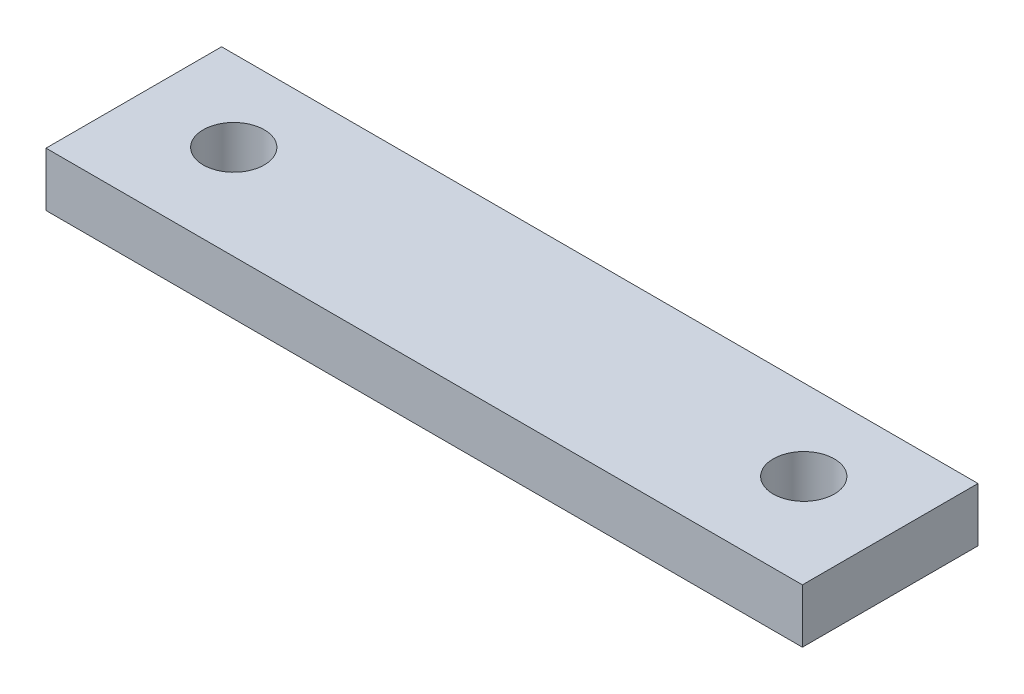
ISO-10303-21;
HEADER;
FILE_DESCRIPTION(('STEP AP214'),'2;1');
FILE_NAME('part.step','',(''),(''),'','','');
FILE_SCHEMA(('AUTOMOTIVE_DESIGN { 1 0 10303 214 1 1 1 1 }'));
ENDSEC;
DATA;
#1=APPLICATION_CONTEXT('core data for automotive mechanical design processes');
#2=APPLICATION_PROTOCOL_DEFINITION('international standard','automotive_design',2000,#1);
#3=PRODUCT_CONTEXT('',#1,'mechanical');
#4=PRODUCT('Part','Part','',(#3));
#5=PRODUCT_RELATED_PRODUCT_CATEGORY('part','',(#4));
#6=PRODUCT_DEFINITION_FORMATION('','',#4);
#7=PRODUCT_DEFINITION_CONTEXT('part definition',#1,'design');
#8=PRODUCT_DEFINITION('design','',#6,#7);
#9=PRODUCT_DEFINITION_SHAPE('','',#8);
#10=(LENGTH_UNIT() NAMED_UNIT(*) SI_UNIT(.MILLI.,.METRE.));
#11=(NAMED_UNIT(*) PLANE_ANGLE_UNIT() SI_UNIT($,.RADIAN.));
#12=(NAMED_UNIT(*) SI_UNIT($,.STERADIAN.) SOLID_ANGLE_UNIT());
#13=UNCERTAINTY_MEASURE_WITH_UNIT(LENGTH_MEASURE(1.E-05),#10,'distance_accuracy_value','');
#14=(GEOMETRIC_REPRESENTATION_CONTEXT(3) GLOBAL_UNCERTAINTY_ASSIGNED_CONTEXT((#13)) GLOBAL_UNIT_ASSIGNED_CONTEXT((#10,
#11,#12)) REPRESENTATION_CONTEXT('',''));
#15=CARTESIAN_POINT('',(0.,0.,0.));
#16=DIRECTION('',(0.,0.,1.));
#17=DIRECTION('',(1.,0.,0.));
#18=AXIS2_PLACEMENT_3D('',#15,#16,#17);
#19=CARTESIAN_POINT('',(0.,2.54,0.));
#20=DIRECTION('',(0.,1.,0.));
#21=DIRECTION('',(0.,0.,1.));
#22=AXIS2_PLACEMENT_3D('',#19,#20,#21);
#23=PLANE('',#22);
#24=CARTESIAN_POINT('',(-13.3985,2.54,0.));
#25=DIRECTION('',(0.,1.,0.));
#26=DIRECTION('',(0.,0.,1.));
#27=AXIS2_PLACEMENT_3D('',#24,#25,#26);
#28=CIRCLE('',#27,1.4351);
#29=CARTESIAN_POINT('',(-13.3985,2.54,1.4351));
#30=VERTEX_POINT('',#29);
#31=EDGE_CURVE('E104',#30,#30,#28,.T.);
#32=ORIENTED_EDGE('',*,*,#31,.F.);
#33=EDGE_LOOP('',(#32));
#34=FACE_BOUND('',#33,.T.);
#35=DIRECTION('',(0.,0.,-1.));
#36=VECTOR('',#35,1.);
#37=CARTESIAN_POINT('',(17.78,2.54,4.445));
#38=LINE('',#37,#36);
#39=CARTESIAN_POINT('',(17.78,2.54,4.445));
#40=VERTEX_POINT('',#39);
#41=CARTESIAN_POINT('',(17.78,2.54,-3.81));
#42=VERTEX_POINT('',#41);
#43=EDGE_CURVE('E89',#40,#42,#38,.T.);
#44=ORIENTED_EDGE('',*,*,#43,.T.);
#45=DIRECTION('',(-1.,0.,0.));
#46=VECTOR('',#45,1.);
#47=CARTESIAN_POINT('',(17.78,2.54,-3.81));
#48=LINE('',#47,#46);
#49=CARTESIAN_POINT('',(-17.78,2.54,-3.81));
#50=VERTEX_POINT('',#49);
#51=EDGE_CURVE('E84',#42,#50,#48,.T.);
#52=ORIENTED_EDGE('',*,*,#51,.T.);
#53=DIRECTION('',(0.,0.,1.));
#54=VECTOR('',#53,1.);
#55=CARTESIAN_POINT('',(-17.78,2.54,-3.81));
#56=LINE('',#55,#54);
#57=CARTESIAN_POINT('',(-17.78,2.54,4.445));
#58=VERTEX_POINT('',#57);
#59=EDGE_CURVE('E87',#50,#58,#56,.T.);
#60=ORIENTED_EDGE('',*,*,#59,.T.);
#61=DIRECTION('',(1.,0.,0.));
#62=VECTOR('',#61,1.);
#63=CARTESIAN_POINT('',(-17.78,2.54,4.445));
#64=LINE('',#63,#62);
#65=EDGE_CURVE('E54',#58,#40,#64,.T.);
#66=ORIENTED_EDGE('',*,*,#65,.T.);
#67=EDGE_LOOP('',(#44,#52,#60,#66));
#68=FACE_BOUND('',#67,.T.);
#69=CARTESIAN_POINT('',(13.3985,2.54,0.));
#70=DIRECTION('',(0.,1.,0.));
#71=DIRECTION('',(0.,0.,1.));
#72=AXIS2_PLACEMENT_3D('',#69,#70,#71);
#73=CIRCLE('',#72,1.4351);
#74=CARTESIAN_POINT('',(13.3985,2.54,1.4351));
#75=VERTEX_POINT('',#74);
#76=EDGE_CURVE('E119',#75,#75,#73,.T.);
#77=ORIENTED_EDGE('',*,*,#76,.F.);
#78=EDGE_LOOP('',(#77));
#79=FACE_BOUND('',#78,.T.);
#80=ADVANCED_FACE('F37',(#34,#68,#79),#23,.T.);
#81=CARTESIAN_POINT('',(0.,0.,0.));
#82=DIRECTION('',(0.,1.,0.));
#83=DIRECTION('',(0.,0.,1.));
#84=AXIS2_PLACEMENT_3D('',#81,#82,#83);
#85=PLANE('',#84);
#86=DIRECTION('',(0.,0.,-1.));
#87=VECTOR('',#86,1.);
#88=CARTESIAN_POINT('',(17.78,0.,4.445));
#89=LINE('',#88,#87);
#90=CARTESIAN_POINT('',(17.78,0.,4.445));
#91=VERTEX_POINT('',#90);
#92=CARTESIAN_POINT('',(17.78,0.,-3.81));
#93=VERTEX_POINT('',#92);
#94=EDGE_CURVE('E101',#91,#93,#89,.T.);
#95=ORIENTED_EDGE('',*,*,#94,.F.);
#96=DIRECTION('',(1.,0.,0.));
#97=VECTOR('',#96,1.);
#98=CARTESIAN_POINT('',(-17.78,0.,4.445));
#99=LINE('',#98,#97);
#100=CARTESIAN_POINT('',(-17.78,0.,4.445));
#101=VERTEX_POINT('',#100);
#102=EDGE_CURVE('E77',#101,#91,#99,.T.);
#103=ORIENTED_EDGE('',*,*,#102,.F.);
#104=DIRECTION('',(0.,0.,1.));
#105=VECTOR('',#104,1.);
#106=CARTESIAN_POINT('',(-17.78,0.,-3.81));
#107=LINE('',#106,#105);
#108=CARTESIAN_POINT('',(-17.78,0.,-3.81));
#109=VERTEX_POINT('',#108);
#110=EDGE_CURVE('E71',#109,#101,#107,.T.);
#111=ORIENTED_EDGE('',*,*,#110,.F.);
#112=DIRECTION('',(-1.,0.,0.));
#113=VECTOR('',#112,1.);
#114=CARTESIAN_POINT('',(17.78,0.,-3.81));
#115=LINE('',#114,#113);
#116=EDGE_CURVE('E93',#93,#109,#115,.T.);
#117=ORIENTED_EDGE('',*,*,#116,.F.);
#118=EDGE_LOOP('',(#95,#103,#111,#117));
#119=FACE_BOUND('',#118,.T.);
#120=CARTESIAN_POINT('',(-13.3985,0.,0.));
#121=DIRECTION('',(0.,1.,0.));
#122=DIRECTION('',(0.,0.,1.));
#123=AXIS2_PLACEMENT_3D('',#120,#121,#122);
#124=CIRCLE('',#123,1.4351);
#125=CARTESIAN_POINT('',(-13.3985,0.,1.4351));
#126=VERTEX_POINT('',#125);
#127=EDGE_CURVE('E116',#126,#126,#124,.T.);
#128=ORIENTED_EDGE('',*,*,#127,.T.);
#129=EDGE_LOOP('',(#128));
#130=FACE_BOUND('',#129,.T.);
#131=CARTESIAN_POINT('',(13.3985,0.,0.));
#132=DIRECTION('',(0.,1.,0.));
#133=DIRECTION('',(0.,0.,1.));
#134=AXIS2_PLACEMENT_3D('',#131,#132,#133);
#135=CIRCLE('',#134,1.4351);
#136=CARTESIAN_POINT('',(13.3985,0.,1.4351));
#137=VERTEX_POINT('',#136);
#138=EDGE_CURVE('E122',#137,#137,#135,.T.);
#139=ORIENTED_EDGE('',*,*,#138,.T.);
#140=EDGE_LOOP('',(#139));
#141=FACE_BOUND('',#140,.T.);
#142=ADVANCED_FACE('F112',(#119,#130,#141),#85,.F.);
#143=CARTESIAN_POINT('',(17.78,2.54,4.445));
#144=DIRECTION('',(-1.,0.,0.));
#145=DIRECTION('',(0.,0.,1.));
#146=AXIS2_PLACEMENT_3D('',#143,#144,#145);
#147=PLANE('',#146);
#148=ORIENTED_EDGE('',*,*,#94,.T.);
#149=DIRECTION('',(0.,-1.,0.));
#150=VECTOR('',#149,1.);
#151=CARTESIAN_POINT('',(17.78,2.54,-3.81));
#152=LINE('',#151,#150);
#153=EDGE_CURVE('E11',#42,#93,#152,.T.);
#154=ORIENTED_EDGE('',*,*,#153,.F.);
#155=ORIENTED_EDGE('',*,*,#43,.F.);
#156=DIRECTION('',(0.,-1.,0.));
#157=VECTOR('',#156,1.);
#158=CARTESIAN_POINT('',(17.78,2.54,4.445));
#159=LINE('',#158,#157);
#160=EDGE_CURVE('E97',#40,#91,#159,.T.);
#161=ORIENTED_EDGE('',*,*,#160,.T.);
#162=EDGE_LOOP('',(#148,#154,#155,#161));
#163=FACE_BOUND('',#162,.T.);
#164=ADVANCED_FACE('F39',(#163),#147,.F.);
#165=CARTESIAN_POINT('',(17.78,2.54,-3.81));
#166=DIRECTION('',(0.,0.,1.));
#167=DIRECTION('',(1.,0.,0.));
#168=AXIS2_PLACEMENT_3D('',#165,#166,#167);
#169=PLANE('',#168);
#170=ORIENTED_EDGE('',*,*,#116,.T.);
#171=DIRECTION('',(0.,-1.,0.));
#172=VECTOR('',#171,1.);
#173=CARTESIAN_POINT('',(-17.78,2.54,-3.81));
#174=LINE('',#173,#172);
#175=EDGE_CURVE('E46',#50,#109,#174,.T.);
#176=ORIENTED_EDGE('',*,*,#175,.F.);
#177=ORIENTED_EDGE('',*,*,#51,.F.);
#178=ORIENTED_EDGE('',*,*,#153,.T.);
#179=EDGE_LOOP('',(#170,#176,#177,#178));
#180=FACE_BOUND('',#179,.T.);
#181=ADVANCED_FACE('F92',(#180),#169,.F.);
#182=CARTESIAN_POINT('',(-17.78,2.54,-3.81));
#183=DIRECTION('',(1.,0.,0.));
#184=DIRECTION('',(0.,0.,-1.));
#185=AXIS2_PLACEMENT_3D('',#182,#183,#184);
#186=PLANE('',#185);
#187=ORIENTED_EDGE('',*,*,#110,.T.);
#188=DIRECTION('',(0.,-1.,0.));
#189=VECTOR('',#188,1.);
#190=CARTESIAN_POINT('',(-17.78,2.54,4.445));
#191=LINE('',#190,#189);
#192=EDGE_CURVE('E94',#58,#101,#191,.T.);
#193=ORIENTED_EDGE('',*,*,#192,.F.);
#194=ORIENTED_EDGE('',*,*,#59,.F.);
#195=ORIENTED_EDGE('',*,*,#175,.T.);
#196=EDGE_LOOP('',(#187,#193,#194,#195));
#197=FACE_BOUND('',#196,.T.);
#198=ADVANCED_FACE('F95',(#197),#186,.F.);
#199=CARTESIAN_POINT('',(-17.78,2.54,4.445));
#200=DIRECTION('',(0.,0.,-1.));
#201=DIRECTION('',(-1.,0.,0.));
#202=AXIS2_PLACEMENT_3D('',#199,#200,#201);
#203=PLANE('',#202);
#204=ORIENTED_EDGE('',*,*,#102,.T.);
#205=ORIENTED_EDGE('',*,*,#160,.F.);
#206=ORIENTED_EDGE('',*,*,#65,.F.);
#207=ORIENTED_EDGE('',*,*,#192,.T.);
#208=EDGE_LOOP('',(#204,#205,#206,#207));
#209=FACE_BOUND('',#208,.T.);
#210=ADVANCED_FACE('F109',(#209),#203,.F.);
#211=CARTESIAN_POINT('',(-13.3985,2.54,0.));
#212=DIRECTION('',(0.,-1.,0.));
#213=DIRECTION('',(0.,0.,-1.));
#214=AXIS2_PLACEMENT_3D('',#211,#212,#213);
#215=CYLINDRICAL_SURFACE('',#214,1.4351);
#216=ORIENTED_EDGE('',*,*,#31,.T.);
#217=EDGE_LOOP('',(#216));
#218=FACE_BOUND('',#217,.T.);
#219=ORIENTED_EDGE('',*,*,#127,.F.);
#220=EDGE_LOOP('',(#219));
#221=FACE_BOUND('',#220,.T.);
#222=ADVANCED_FACE('F139',(#218,#221),#215,.F.);
#223=CARTESIAN_POINT('',(13.3985,2.54,0.));
#224=DIRECTION('',(0.,-1.,0.));
#225=DIRECTION('',(0.,0.,-1.));
#226=AXIS2_PLACEMENT_3D('',#223,#224,#225);
#227=CYLINDRICAL_SURFACE('',#226,1.4351);
#228=ORIENTED_EDGE('',*,*,#76,.T.);
#229=EDGE_LOOP('',(#228));
#230=FACE_BOUND('',#229,.T.);
#231=ORIENTED_EDGE('',*,*,#138,.F.);
#232=EDGE_LOOP('',(#231));
#233=FACE_BOUND('',#232,.T.);
#234=ADVANCED_FACE('F128',(#230,#233),#227,.F.);
#235=CLOSED_SHELL('',(#80,#142,#164,#181,#198,#210,#222,#234));
#236=MANIFOLD_SOLID_BREP('B2',#235);
#237=ADVANCED_BREP_SHAPE_REPRESENTATION('',(#18,#236),#14);
#238=SHAPE_DEFINITION_REPRESENTATION(#9,#237);
ENDSEC;
END-ISO-10303-21;
